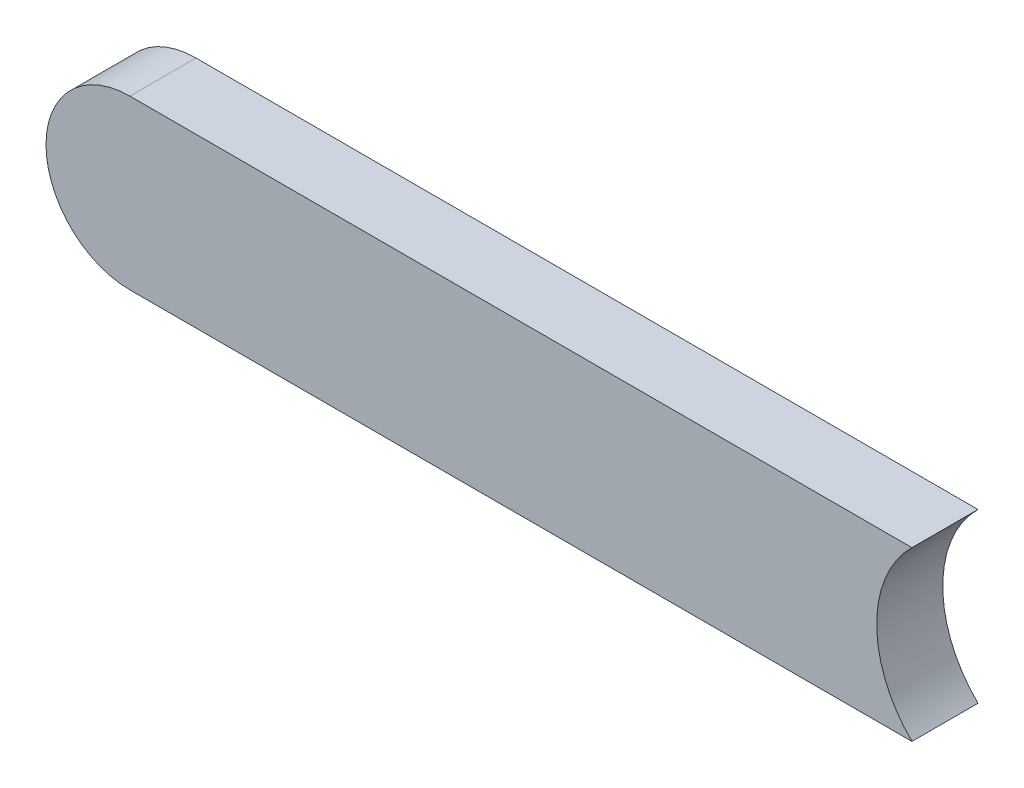
ISO-10303-21;
HEADER;
FILE_DESCRIPTION(('STEP AP214'),'2;1');
FILE_NAME('part.step','',(''),(''),'','','');
FILE_SCHEMA(('AUTOMOTIVE_DESIGN { 1 0 10303 214 1 1 1 1 }'));
ENDSEC;
DATA;
#1=APPLICATION_CONTEXT('core data for automotive mechanical design processes');
#2=APPLICATION_PROTOCOL_DEFINITION('international standard','automotive_design',2000,#1);
#3=PRODUCT_CONTEXT('',#1,'mechanical');
#4=PRODUCT('Part','Part','',(#3));
#5=PRODUCT_RELATED_PRODUCT_CATEGORY('part','',(#4));
#6=PRODUCT_DEFINITION_FORMATION('','',#4);
#7=PRODUCT_DEFINITION_CONTEXT('part definition',#1,'design');
#8=PRODUCT_DEFINITION('design','',#6,#7);
#9=PRODUCT_DEFINITION_SHAPE('','',#8);
#10=(LENGTH_UNIT() NAMED_UNIT(*) SI_UNIT(.MILLI.,.METRE.));
#11=(NAMED_UNIT(*) PLANE_ANGLE_UNIT() SI_UNIT($,.RADIAN.));
#12=(NAMED_UNIT(*) SI_UNIT($,.STERADIAN.) SOLID_ANGLE_UNIT());
#13=UNCERTAINTY_MEASURE_WITH_UNIT(LENGTH_MEASURE(1.E-05),#10,'distance_accuracy_value','');
#14=(GEOMETRIC_REPRESENTATION_CONTEXT(3) GLOBAL_UNCERTAINTY_ASSIGNED_CONTEXT((#13)) GLOBAL_UNIT_ASSIGNED_CONTEXT((#10,
#11,#12)) REPRESENTATION_CONTEXT('',''));
#15=CARTESIAN_POINT('',(0.,0.,0.));
#16=DIRECTION('',(0.,0.,1.));
#17=DIRECTION('',(1.,0.,0.));
#18=AXIS2_PLACEMENT_3D('',#15,#16,#17);
#19=CARTESIAN_POINT('',(152.1968,75.565,0.));
#20=DIRECTION('',(0.,1.,0.));
#21=DIRECTION('',(1.,0.,0.));
#22=AXIS2_PLACEMENT_3D('',#19,#20,#21);
#23=PLANE('',#22);
#24=DIRECTION('',(1.,0.,0.));
#25=VECTOR('',#24,1.);
#26=CARTESIAN_POINT('',(152.1968,75.565,0.1999996));
#27=LINE('',#26,#25);
#28=CARTESIAN_POINT('',(152.1968,75.565,0.1999996));
#29=VERTEX_POINT('',#28);
#30=CARTESIAN_POINT('',(154.564131842133,75.565,0.1999996));
#31=VERTEX_POINT('',#30);
#32=EDGE_CURVE('E11',#29,#31,#27,.T.);
#33=ORIENTED_EDGE('',*,*,#32,.F.);
#34=DIRECTION('',(0.,0.,1.));
#35=VECTOR('',#34,1.);
#36=CARTESIAN_POINT('',(152.1968,75.565,0.));
#37=LINE('',#36,#35);
#38=CARTESIAN_POINT('',(152.1968,75.565,0.));
#39=VERTEX_POINT('',#38);
#40=EDGE_CURVE('E24',#39,#29,#37,.T.);
#41=ORIENTED_EDGE('',*,*,#40,.F.);
#42=DIRECTION('',(1.,0.,0.));
#43=VECTOR('',#42,1.);
#44=CARTESIAN_POINT('',(152.1968,75.565,0.));
#45=LINE('',#44,#43);
#46=CARTESIAN_POINT('',(154.564131842133,75.565,0.));
#47=VERTEX_POINT('',#46);
#48=EDGE_CURVE('E75',#39,#47,#45,.T.);
#49=ORIENTED_EDGE('',*,*,#48,.T.);
#50=DIRECTION('',(0.,0.,1.));
#51=VECTOR('',#50,1.);
#52=CARTESIAN_POINT('',(154.564131842133,75.565,0.));
#53=LINE('',#52,#51);
#54=EDGE_CURVE('E37',#47,#31,#53,.T.);
#55=ORIENTED_EDGE('',*,*,#54,.T.);
#56=EDGE_LOOP('',(#33,#41,#49,#55));
#57=FACE_BOUND('',#56,.T.);
#58=ADVANCED_FACE('F17',(#57),#23,.F.);
#59=CARTESIAN_POINT('',(154.813,75.819,0.));
#60=DIRECTION('',(0.,0.,-1.));
#61=DIRECTION('',(1.,0.,0.));
#62=AXIS2_PLACEMENT_3D('',#59,#60,#61);
#63=CYLINDRICAL_SURFACE('',#62,0.3556);
#64=DIRECTION('',(0.,0.,1.));
#65=VECTOR('',#64,1.);
#66=CARTESIAN_POINT('',(154.564131842133,76.073,0.));
#67=LINE('',#66,#65);
#68=CARTESIAN_POINT('',(154.564131842133,76.073,0.));
#69=VERTEX_POINT('',#68);
#70=CARTESIAN_POINT('',(154.564131842133,76.073,0.1999996));
#71=VERTEX_POINT('',#70);
#72=EDGE_CURVE('E67',#69,#71,#67,.T.);
#73=ORIENTED_EDGE('',*,*,#72,.T.);
#74=CARTESIAN_POINT('',(154.813,75.819,0.1999996));
#75=DIRECTION('',(0.,0.,1.));
#76=DIRECTION('',(1.,0.,0.));
#77=AXIS2_PLACEMENT_3D('',#74,#75,#76);
#78=CIRCLE('',#77,0.3556);
#79=EDGE_CURVE('E82',#71,#31,#78,.T.);
#80=ORIENTED_EDGE('',*,*,#79,.T.);
#81=ORIENTED_EDGE('',*,*,#54,.F.);
#82=CARTESIAN_POINT('',(154.813,75.819,0.));
#83=DIRECTION('',(0.,0.,1.));
#84=DIRECTION('',(1.,0.,0.));
#85=AXIS2_PLACEMENT_3D('',#82,#83,#84);
#86=CIRCLE('',#85,0.3556);
#87=EDGE_CURVE('E80',#69,#47,#86,.T.);
#88=ORIENTED_EDGE('',*,*,#87,.F.);
#89=EDGE_LOOP('',(#73,#80,#81,#88));
#90=FACE_BOUND('',#89,.T.);
#91=ADVANCED_FACE('F88',(#90),#63,.F.);
#92=CARTESIAN_POINT('',(154.564131842133,76.073,0.));
#93=DIRECTION('',(0.,-1.,0.));
#94=DIRECTION('',(-1.,0.,0.));
#95=AXIS2_PLACEMENT_3D('',#92,#93,#94);
#96=PLANE('',#95);
#97=DIRECTION('',(-1.,0.,0.));
#98=VECTOR('',#97,1.);
#99=CARTESIAN_POINT('',(154.813,76.073,0.1999996));
#100=LINE('',#99,#98);
#101=CARTESIAN_POINT('',(152.1968,76.073,0.1999996));
#102=VERTEX_POINT('',#101);
#103=EDGE_CURVE('E71',#71,#102,#100,.T.);
#104=ORIENTED_EDGE('',*,*,#103,.F.);
#105=ORIENTED_EDGE('',*,*,#72,.F.);
#106=DIRECTION('',(-1.,0.,0.));
#107=VECTOR('',#106,1.);
#108=CARTESIAN_POINT('',(154.813,76.073,0.));
#109=LINE('',#108,#107);
#110=CARTESIAN_POINT('',(152.1968,76.073,0.));
#111=VERTEX_POINT('',#110);
#112=EDGE_CURVE('E63',#69,#111,#109,.T.);
#113=ORIENTED_EDGE('',*,*,#112,.T.);
#114=DIRECTION('',(0.,0.,1.));
#115=VECTOR('',#114,1.);
#116=CARTESIAN_POINT('',(152.1968,76.073,0.));
#117=LINE('',#116,#115);
#118=EDGE_CURVE('E53',#111,#102,#117,.T.);
#119=ORIENTED_EDGE('',*,*,#118,.T.);
#120=EDGE_LOOP('',(#104,#105,#113,#119));
#121=FACE_BOUND('',#120,.T.);
#122=ADVANCED_FACE('F66',(#121),#96,.F.);
#123=CARTESIAN_POINT('',(152.1968,75.819,0.));
#124=DIRECTION('',(0.,0.,-1.));
#125=DIRECTION('',(0.,1.,0.));
#126=AXIS2_PLACEMENT_3D('',#123,#124,#125);
#127=CYLINDRICAL_SURFACE('',#126,0.253999999999995);
#128=CARTESIAN_POINT('',(152.1968,75.819,0.1999996));
#129=DIRECTION('',(0.,0.,1.));
#130=DIRECTION('',(0.,1.,0.));
#131=AXIS2_PLACEMENT_3D('',#128,#129,#130);
#132=CIRCLE('',#131,0.253999999999995);
#133=EDGE_CURVE('E59',#102,#29,#132,.T.);
#134=ORIENTED_EDGE('',*,*,#133,.F.);
#135=ORIENTED_EDGE('',*,*,#118,.F.);
#136=CARTESIAN_POINT('',(152.1968,75.819,0.));
#137=DIRECTION('',(0.,0.,1.));
#138=DIRECTION('',(0.,1.,0.));
#139=AXIS2_PLACEMENT_3D('',#136,#137,#138);
#140=CIRCLE('',#139,0.253999999999995);
#141=EDGE_CURVE('E57',#111,#39,#140,.T.);
#142=ORIENTED_EDGE('',*,*,#141,.T.);
#143=ORIENTED_EDGE('',*,*,#40,.T.);
#144=EDGE_LOOP('',(#134,#135,#142,#143));
#145=FACE_BOUND('',#144,.T.);
#146=ADVANCED_FACE('F55',(#145),#127,.T.);
#147=CARTESIAN_POINT('',(152.1968,75.565,0.));
#148=DIRECTION('',(0.,0.,-1.));
#149=DIRECTION('',(-1.,0.,0.));
#150=AXIS2_PLACEMENT_3D('',#147,#148,#149);
#151=PLANE('',#150);
#152=ORIENTED_EDGE('',*,*,#48,.F.);
#153=ORIENTED_EDGE('',*,*,#141,.F.);
#154=ORIENTED_EDGE('',*,*,#112,.F.);
#155=ORIENTED_EDGE('',*,*,#87,.T.);
#156=EDGE_LOOP('',(#152,#153,#154,#155));
#157=FACE_BOUND('',#156,.T.);
#158=ADVANCED_FACE('F74',(#157),#151,.T.);
#159=CARTESIAN_POINT('',(152.1968,75.565,0.1999996));
#160=DIRECTION('',(0.,0.,-1.));
#161=DIRECTION('',(-1.,0.,0.));
#162=AXIS2_PLACEMENT_3D('',#159,#160,#161);
#163=PLANE('',#162);
#164=ORIENTED_EDGE('',*,*,#133,.T.);
#165=ORIENTED_EDGE('',*,*,#32,.T.);
#166=ORIENTED_EDGE('',*,*,#79,.F.);
#167=ORIENTED_EDGE('',*,*,#103,.T.);
#168=EDGE_LOOP('',(#164,#165,#166,#167));
#169=FACE_BOUND('',#168,.T.);
#170=ADVANCED_FACE('F91',(#169),#163,.F.);
#171=CLOSED_SHELL('',(#58,#91,#122,#146,#158,#170));
#172=MANIFOLD_SOLID_BREP('B1',#171);
#173=ADVANCED_BREP_SHAPE_REPRESENTATION('',(#18,#172),#14);
#174=SHAPE_DEFINITION_REPRESENTATION(#9,#173);
ENDSEC;
END-ISO-10303-21;
